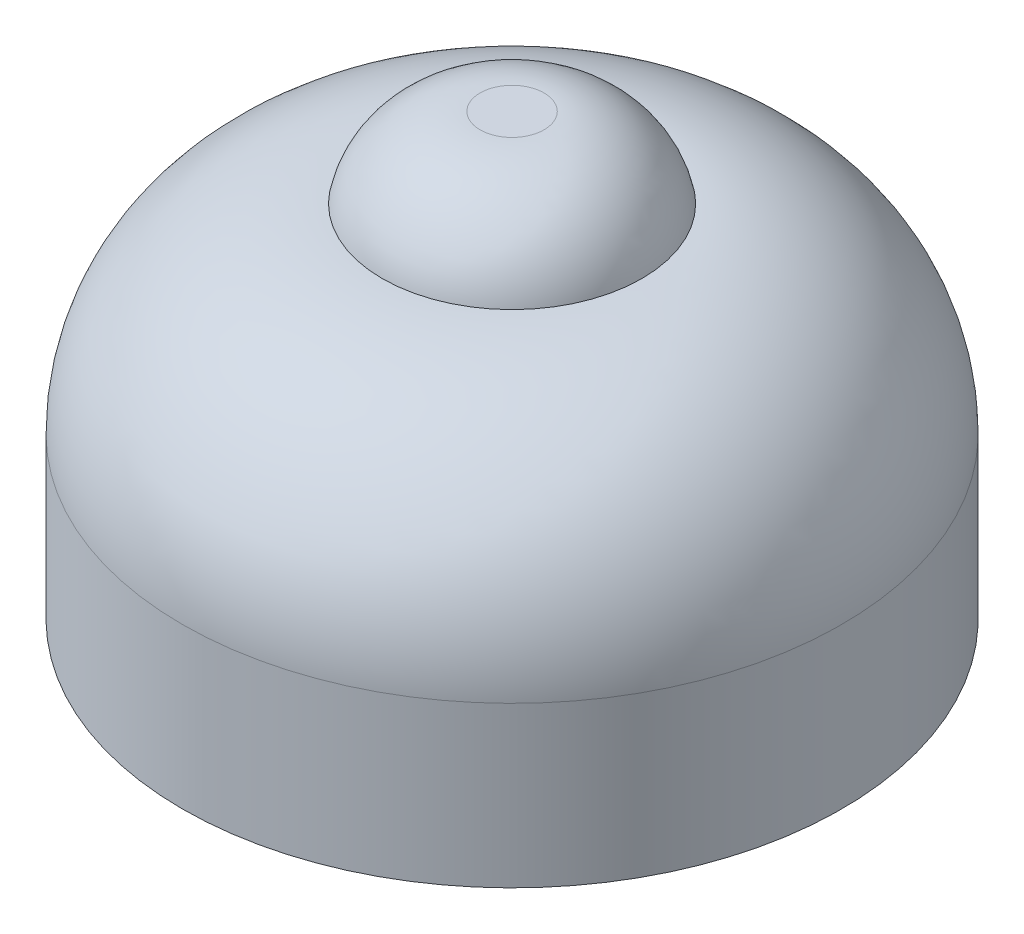
ISO-10303-21;
HEADER;
FILE_DESCRIPTION(('STEP AP214'),'2;1');
FILE_NAME('part.step','',(''),(''),'','','');
FILE_SCHEMA(('AUTOMOTIVE_DESIGN { 1 0 10303 214 1 1 1 1 }'));
ENDSEC;
DATA;
#1=APPLICATION_CONTEXT('core data for automotive mechanical design processes');
#2=APPLICATION_PROTOCOL_DEFINITION('international standard','automotive_design',2000,#1);
#3=PRODUCT_CONTEXT('',#1,'mechanical');
#4=PRODUCT('Part','Part','',(#3));
#5=PRODUCT_RELATED_PRODUCT_CATEGORY('part','',(#4));
#6=PRODUCT_DEFINITION_FORMATION('','',#4);
#7=PRODUCT_DEFINITION_CONTEXT('part definition',#1,'design');
#8=PRODUCT_DEFINITION('design','',#6,#7);
#9=PRODUCT_DEFINITION_SHAPE('','',#8);
#10=(LENGTH_UNIT() NAMED_UNIT(*) SI_UNIT(.MILLI.,.METRE.));
#11=(NAMED_UNIT(*) PLANE_ANGLE_UNIT() SI_UNIT($,.RADIAN.));
#12=(NAMED_UNIT(*) SI_UNIT($,.STERADIAN.) SOLID_ANGLE_UNIT());
#13=UNCERTAINTY_MEASURE_WITH_UNIT(LENGTH_MEASURE(1.E-05),#10,'distance_accuracy_value','');
#14=(GEOMETRIC_REPRESENTATION_CONTEXT(3) GLOBAL_UNCERTAINTY_ASSIGNED_CONTEXT((#13)) GLOBAL_UNIT_ASSIGNED_CONTEXT((#10,
#11,#12)) REPRESENTATION_CONTEXT('',''));
#15=CARTESIAN_POINT('',(0.,0.,0.));
#16=DIRECTION('',(0.,0.,1.));
#17=DIRECTION('',(1.,0.,0.));
#18=AXIS2_PLACEMENT_3D('',#15,#16,#17);
#19=CARTESIAN_POINT('',(0.,18.,0.));
#20=DIRECTION('',(0.,-1.,0.));
#21=DIRECTION('',(0.,0.,-1.));
#22=AXIS2_PLACEMENT_3D('',#19,#20,#21);
#23=CYLINDRICAL_SURFACE('',#22,16.5);
#24=CARTESIAN_POINT('',(0.,8.,0.));
#25=DIRECTION('',(0.,1.,0.));
#26=DIRECTION('',(0.,0.,1.));
#27=AXIS2_PLACEMENT_3D('',#24,#25,#26);
#28=CIRCLE('',#27,16.5);
#29=CARTESIAN_POINT('',(0.,8.,16.5));
#30=VERTEX_POINT('',#29);
#31=EDGE_CURVE('E38',#30,#30,#28,.F.);
#32=ORIENTED_EDGE('',*,*,#31,.T.);
#33=EDGE_LOOP('',(#32));
#34=FACE_BOUND('',#33,.T.);
#35=CARTESIAN_POINT('',(0.,0.,0.));
#36=DIRECTION('',(0.,1.,0.));
#37=DIRECTION('',(0.,0.,1.));
#38=AXIS2_PLACEMENT_3D('',#35,#36,#37);
#39=CIRCLE('',#38,16.5);
#40=CARTESIAN_POINT('',(0.,0.,16.5));
#41=VERTEX_POINT('',#40);
#42=EDGE_CURVE('E46',#41,#41,#39,.T.);
#43=ORIENTED_EDGE('',*,*,#42,.T.);
#44=EDGE_LOOP('',(#43));
#45=FACE_BOUND('',#44,.T.);
#46=ADVANCED_FACE('F31',(#34,#45),#23,.T.);
#47=CARTESIAN_POINT('',(0.,0.,0.));
#48=DIRECTION('',(0.,1.,0.));
#49=DIRECTION('',(0.,0.,1.));
#50=AXIS2_PLACEMENT_3D('',#47,#48,#49);
#51=PLANE('',#50);
#52=ORIENTED_EDGE('',*,*,#42,.F.);
#53=EDGE_LOOP('',(#52));
#54=FACE_BOUND('',#53,.T.);
#55=ADVANCED_FACE('F53',(#54),#51,.F.);
#56=CARTESIAN_POINT('',(0.,8.,0.));
#57=DIRECTION('',(0.,1.,0.));
#58=DIRECTION('',(0.,0.,1.));
#59=AXIS2_PLACEMENT_3D('',#56,#57,#58);
#60=DEGENERATE_TOROIDAL_SURFACE('',#59,6.5,10.,.T.);
#61=ORIENTED_EDGE('',*,*,#31,.F.);
#62=EDGE_LOOP('',(#61));
#63=FACE_BOUND('',#62,.T.);
#64=CARTESIAN_POINT('',(0.,18.,0.));
#65=DIRECTION('',(0.,1.,0.));
#66=DIRECTION('',(0.,0.,1.));
#67=AXIS2_PLACEMENT_3D('',#64,#65,#66);
#68=CIRCLE('',#67,6.5);
#69=CARTESIAN_POINT('',(0.,18.,6.5));
#70=VERTEX_POINT('',#69);
#71=EDGE_CURVE('E42',#70,#70,#68,.T.);
#72=ORIENTED_EDGE('',*,*,#71,.F.);
#73=EDGE_LOOP('',(#72));
#74=FACE_BOUND('',#73,.T.);
#75=ADVANCED_FACE('F55',(#63,#74),#60,.T.);
#76=CARTESIAN_POINT('',(0.,22.,0.));
#77=DIRECTION('',(0.,1.,0.));
#78=DIRECTION('',(0.,0.,1.));
#79=AXIS2_PLACEMENT_3D('',#76,#77,#78);
#80=PLANE('',#79);
#81=CARTESIAN_POINT('',(0.,22.,0.));
#82=DIRECTION('',(0.,1.,0.));
#83=DIRECTION('',(0.,0.,1.));
#84=AXIS2_PLACEMENT_3D('',#81,#82,#83);
#85=CIRCLE('',#84,1.60102051443365);
#86=CARTESIAN_POINT('',(0.,22.,1.60102051443365));
#87=VERTEX_POINT('',#86);
#88=EDGE_CURVE('E10',#87,#87,#85,.T.);
#89=ORIENTED_EDGE('',*,*,#88,.T.);
#90=EDGE_LOOP('',(#89));
#91=FACE_BOUND('',#90,.T.);
#92=ADVANCED_FACE('F61',(#91),#80,.T.);
#93=CARTESIAN_POINT('',(0.,17.,0.));
#94=DIRECTION('',(0.,-1.,0.));
#95=DIRECTION('',(0.,0.,-1.));
#96=AXIS2_PLACEMENT_3D('',#93,#94,#95);
#97=DEGENERATE_TOROIDAL_SURFACE('',#96,1.60102051443365,5.,.T.);
#98=ORIENTED_EDGE('',*,*,#71,.T.);
#99=EDGE_LOOP('',(#98));
#100=FACE_BOUND('',#99,.T.);
#101=ORIENTED_EDGE('',*,*,#88,.F.);
#102=EDGE_LOOP('',(#101));
#103=FACE_BOUND('',#102,.T.);
#104=ADVANCED_FACE('F33',(#100,#103),#97,.T.);
#105=CLOSED_SHELL('',(#46,#55,#75,#92,#104));
#106=MANIFOLD_SOLID_BREP('B2',#105);
#107=ADVANCED_BREP_SHAPE_REPRESENTATION('',(#18,#106),#14);
#108=SHAPE_DEFINITION_REPRESENTATION(#9,#107);
ENDSEC;
END-ISO-10303-21;
